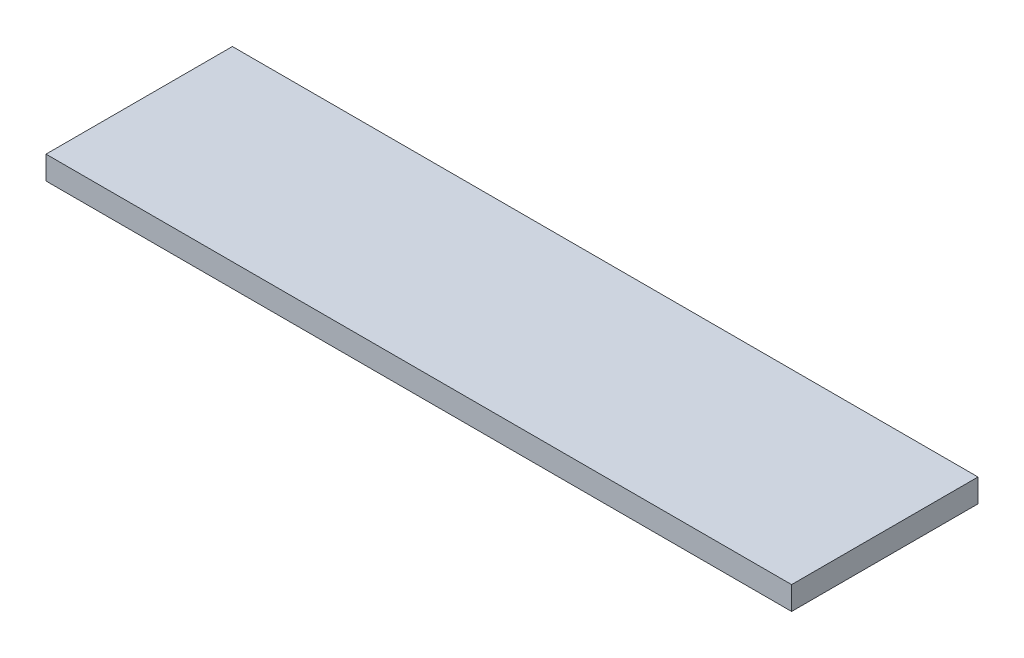
ISO-10303-21;
HEADER;
FILE_DESCRIPTION(('STEP AP214'),'2;1');
FILE_NAME('part.step','',(''),(''),'','','');
FILE_SCHEMA(('AUTOMOTIVE_DESIGN { 1 0 10303 214 1 1 1 1 }'));
ENDSEC;
DATA;
#1=APPLICATION_CONTEXT('core data for automotive mechanical design processes');
#2=APPLICATION_PROTOCOL_DEFINITION('international standard','automotive_design',2000,#1);
#3=PRODUCT_CONTEXT('',#1,'mechanical');
#4=PRODUCT('Part','Part','',(#3));
#5=PRODUCT_RELATED_PRODUCT_CATEGORY('part','',(#4));
#6=PRODUCT_DEFINITION_FORMATION('','',#4);
#7=PRODUCT_DEFINITION_CONTEXT('part definition',#1,'design');
#8=PRODUCT_DEFINITION('design','',#6,#7);
#9=PRODUCT_DEFINITION_SHAPE('','',#8);
#10=(LENGTH_UNIT() NAMED_UNIT(*) SI_UNIT(.MILLI.,.METRE.));
#11=(NAMED_UNIT(*) PLANE_ANGLE_UNIT() SI_UNIT($,.RADIAN.));
#12=(NAMED_UNIT(*) SI_UNIT($,.STERADIAN.) SOLID_ANGLE_UNIT());
#13=UNCERTAINTY_MEASURE_WITH_UNIT(LENGTH_MEASURE(1.E-05),#10,'distance_accuracy_value','');
#14=(GEOMETRIC_REPRESENTATION_CONTEXT(3) GLOBAL_UNCERTAINTY_ASSIGNED_CONTEXT((#13)) GLOBAL_UNIT_ASSIGNED_CONTEXT((#10,
#11,#12)) REPRESENTATION_CONTEXT('',''));
#15=CARTESIAN_POINT('',(0.,0.,0.));
#16=DIRECTION('',(0.,0.,1.));
#17=DIRECTION('',(1.,0.,0.));
#18=AXIS2_PLACEMENT_3D('',#15,#16,#17);
#19=CARTESIAN_POINT('',(0.,3.175,0.));
#20=DIRECTION('',(1.,0.,0.));
#21=DIRECTION('',(0.,0.,-1.));
#22=AXIS2_PLACEMENT_3D('',#19,#20,#21);
#23=PLANE('',#22);
#24=DIRECTION('',(0.,0.,1.));
#25=VECTOR('',#24,1.);
#26=CARTESIAN_POINT('',(0.,0.,0.));
#27=LINE('',#26,#25);
#28=CARTESIAN_POINT('',(0.,0.,-25.4));
#29=VERTEX_POINT('',#28);
#30=CARTESIAN_POINT('',(0.,0.,0.));
#31=VERTEX_POINT('',#30);
#32=EDGE_CURVE('E96',#29,#31,#27,.T.);
#33=ORIENTED_EDGE('',*,*,#32,.T.);
#34=DIRECTION('',(0.,-1.,0.));
#35=VECTOR('',#34,1.);
#36=CARTESIAN_POINT('',(0.,3.175,0.));
#37=LINE('',#36,#35);
#38=CARTESIAN_POINT('',(0.,3.175,0.));
#39=VERTEX_POINT('',#38);
#40=EDGE_CURVE('E11',#39,#31,#37,.T.);
#41=ORIENTED_EDGE('',*,*,#40,.F.);
#42=DIRECTION('',(0.,0.,1.));
#43=VECTOR('',#42,1.);
#44=CARTESIAN_POINT('',(0.,3.175,0.));
#45=LINE('',#44,#43);
#46=CARTESIAN_POINT('',(0.,3.175,-25.4));
#47=VERTEX_POINT('',#46);
#48=EDGE_CURVE('E84',#47,#39,#45,.T.);
#49=ORIENTED_EDGE('',*,*,#48,.F.);
#50=DIRECTION('',(0.,-1.,0.));
#51=VECTOR('',#50,1.);
#52=CARTESIAN_POINT('',(0.,3.175,-25.4));
#53=LINE('',#52,#51);
#54=EDGE_CURVE('E92',#47,#29,#53,.T.);
#55=ORIENTED_EDGE('',*,*,#54,.T.);
#56=EDGE_LOOP('',(#33,#41,#49,#55));
#57=FACE_BOUND('',#56,.T.);
#58=ADVANCED_FACE('F33',(#57),#23,.F.);
#59=CARTESIAN_POINT('',(0.,3.175,0.));
#60=DIRECTION('',(0.,0.,-1.));
#61=DIRECTION('',(-1.,0.,0.));
#62=AXIS2_PLACEMENT_3D('',#59,#60,#61);
#63=PLANE('',#62);
#64=DIRECTION('',(1.,0.,0.));
#65=VECTOR('',#64,1.);
#66=CARTESIAN_POINT('',(0.,0.,0.));
#67=LINE('',#66,#65);
#68=CARTESIAN_POINT('',(101.6,0.,0.));
#69=VERTEX_POINT('',#68);
#70=EDGE_CURVE('E88',#31,#69,#67,.T.);
#71=ORIENTED_EDGE('',*,*,#70,.T.);
#72=DIRECTION('',(0.,-1.,0.));
#73=VECTOR('',#72,1.);
#74=CARTESIAN_POINT('',(101.6,3.175,0.));
#75=LINE('',#74,#73);
#76=CARTESIAN_POINT('',(101.6,3.175,0.));
#77=VERTEX_POINT('',#76);
#78=EDGE_CURVE('E41',#77,#69,#75,.T.);
#79=ORIENTED_EDGE('',*,*,#78,.F.);
#80=DIRECTION('',(1.,0.,0.));
#81=VECTOR('',#80,1.);
#82=CARTESIAN_POINT('',(0.,3.175,0.));
#83=LINE('',#82,#81);
#84=EDGE_CURVE('E79',#39,#77,#83,.T.);
#85=ORIENTED_EDGE('',*,*,#84,.F.);
#86=ORIENTED_EDGE('',*,*,#40,.T.);
#87=EDGE_LOOP('',(#71,#79,#85,#86));
#88=FACE_BOUND('',#87,.T.);
#89=ADVANCED_FACE('F87',(#88),#63,.F.);
#90=CARTESIAN_POINT('',(101.6,3.175,0.));
#91=DIRECTION('',(-1.,0.,0.));
#92=DIRECTION('',(0.,0.,1.));
#93=AXIS2_PLACEMENT_3D('',#90,#91,#92);
#94=PLANE('',#93);
#95=DIRECTION('',(0.,0.,-1.));
#96=VECTOR('',#95,1.);
#97=CARTESIAN_POINT('',(101.6,0.,0.));
#98=LINE('',#97,#96);
#99=CARTESIAN_POINT('',(101.6,0.,-25.4));
#100=VERTEX_POINT('',#99);
#101=EDGE_CURVE('E66',#69,#100,#98,.T.);
#102=ORIENTED_EDGE('',*,*,#101,.T.);
#103=DIRECTION('',(0.,-1.,0.));
#104=VECTOR('',#103,1.);
#105=CARTESIAN_POINT('',(101.6,3.175,-25.4));
#106=LINE('',#105,#104);
#107=CARTESIAN_POINT('',(101.6,3.175,-25.4));
#108=VERTEX_POINT('',#107);
#109=EDGE_CURVE('E89',#108,#100,#106,.T.);
#110=ORIENTED_EDGE('',*,*,#109,.F.);
#111=DIRECTION('',(0.,0.,-1.));
#112=VECTOR('',#111,1.);
#113=CARTESIAN_POINT('',(101.6,3.175,0.));
#114=LINE('',#113,#112);
#115=EDGE_CURVE('E82',#77,#108,#114,.T.);
#116=ORIENTED_EDGE('',*,*,#115,.F.);
#117=ORIENTED_EDGE('',*,*,#78,.T.);
#118=EDGE_LOOP('',(#102,#110,#116,#117));
#119=FACE_BOUND('',#118,.T.);
#120=ADVANCED_FACE('F90',(#119),#94,.F.);
#121=CARTESIAN_POINT('',(0.,3.175,-25.4));
#122=DIRECTION('',(0.,0.,1.));
#123=DIRECTION('',(1.,0.,0.));
#124=AXIS2_PLACEMENT_3D('',#121,#122,#123);
#125=PLANE('',#124);
#126=DIRECTION('',(-1.,0.,0.));
#127=VECTOR('',#126,1.);
#128=CARTESIAN_POINT('',(0.,0.,-25.4));
#129=LINE('',#128,#127);
#130=EDGE_CURVE('E72',#100,#29,#129,.T.);
#131=ORIENTED_EDGE('',*,*,#130,.T.);
#132=ORIENTED_EDGE('',*,*,#54,.F.);
#133=DIRECTION('',(-1.,0.,0.));
#134=VECTOR('',#133,1.);
#135=CARTESIAN_POINT('',(0.,3.175,-25.4));
#136=LINE('',#135,#134);
#137=EDGE_CURVE('E49',#108,#47,#136,.T.);
#138=ORIENTED_EDGE('',*,*,#137,.F.);
#139=ORIENTED_EDGE('',*,*,#109,.T.);
#140=EDGE_LOOP('',(#131,#132,#138,#139));
#141=FACE_BOUND('',#140,.T.);
#142=ADVANCED_FACE('F103',(#141),#125,.F.);
#143=CARTESIAN_POINT('',(0.,3.175,0.));
#144=DIRECTION('',(0.,-1.,0.));
#145=DIRECTION('',(0.,0.,-1.));
#146=AXIS2_PLACEMENT_3D('',#143,#144,#145);
#147=PLANE('',#146);
#148=ORIENTED_EDGE('',*,*,#48,.T.);
#149=ORIENTED_EDGE('',*,*,#84,.T.);
#150=ORIENTED_EDGE('',*,*,#115,.T.);
#151=ORIENTED_EDGE('',*,*,#137,.T.);
#152=EDGE_LOOP('',(#148,#149,#150,#151));
#153=FACE_BOUND('',#152,.T.);
#154=ADVANCED_FACE('F80',(#153),#147,.F.);
#155=CARTESIAN_POINT('',(0.,0.,0.));
#156=DIRECTION('',(0.,-1.,0.));
#157=DIRECTION('',(0.,0.,-1.));
#158=AXIS2_PLACEMENT_3D('',#155,#156,#157);
#159=PLANE('',#158);
#160=ORIENTED_EDGE('',*,*,#32,.F.);
#161=ORIENTED_EDGE('',*,*,#130,.F.);
#162=ORIENTED_EDGE('',*,*,#101,.F.);
#163=ORIENTED_EDGE('',*,*,#70,.F.);
#164=EDGE_LOOP('',(#160,#161,#162,#163));
#165=FACE_BOUND('',#164,.T.);
#166=ADVANCED_FACE('F106',(#165),#159,.T.);
#167=CLOSED_SHELL('',(#58,#89,#120,#142,#154,#166));
#168=MANIFOLD_SOLID_BREP('B2',#167);
#169=ADVANCED_BREP_SHAPE_REPRESENTATION('',(#18,#168),#14);
#170=SHAPE_DEFINITION_REPRESENTATION(#9,#169);
ENDSEC;
END-ISO-10303-21;
